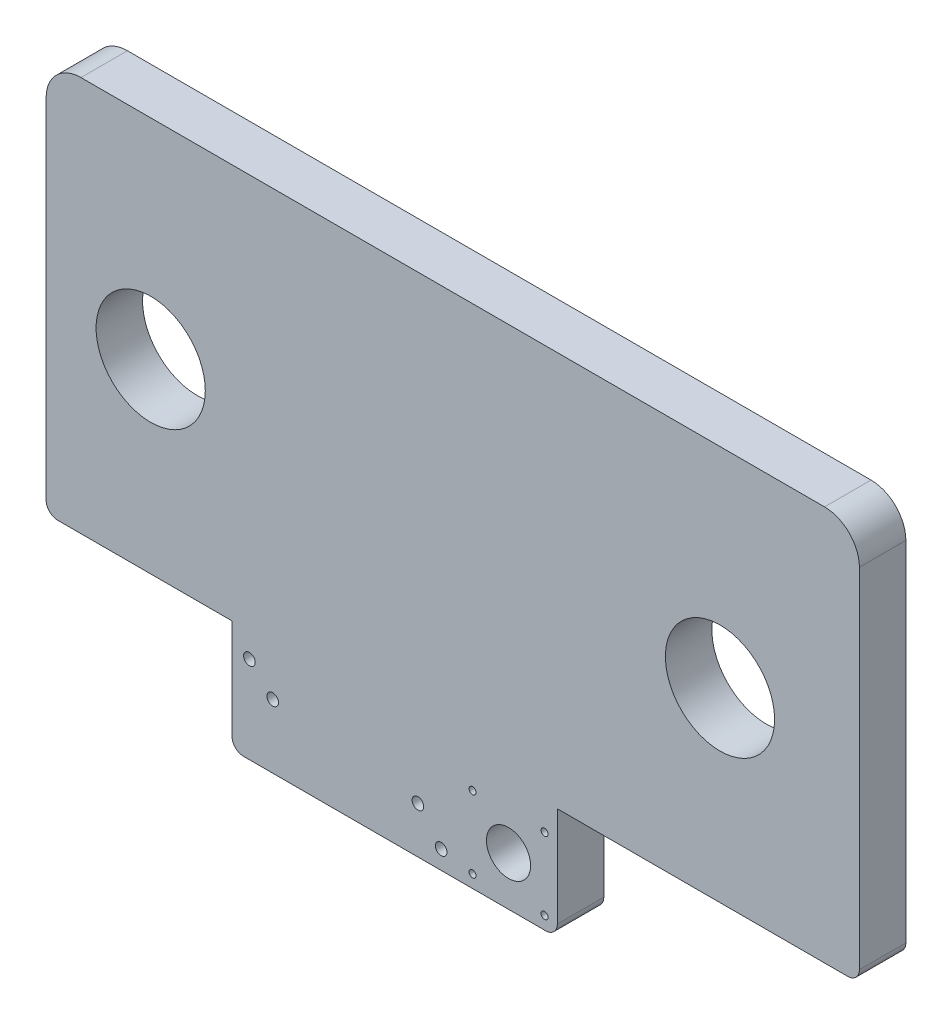
ISO-10303-21;
HEADER;
FILE_DESCRIPTION(('STEP AP214'),'2;1');
FILE_NAME('part.step','',(''),(''),'','','');
FILE_SCHEMA(('AUTOMOTIVE_DESIGN { 1 0 10303 214 1 1 1 1 }'));
ENDSEC;
DATA;
#1=APPLICATION_CONTEXT('core data for automotive mechanical design processes');
#2=APPLICATION_PROTOCOL_DEFINITION('international standard','automotive_design',2000,#1);
#3=PRODUCT_CONTEXT('',#1,'mechanical');
#4=PRODUCT('Part','Part','',(#3));
#5=PRODUCT_RELATED_PRODUCT_CATEGORY('part','',(#4));
#6=PRODUCT_DEFINITION_FORMATION('','',#4);
#7=PRODUCT_DEFINITION_CONTEXT('part definition',#1,'design');
#8=PRODUCT_DEFINITION('design','',#6,#7);
#9=PRODUCT_DEFINITION_SHAPE('','',#8);
#10=(LENGTH_UNIT() NAMED_UNIT(*) SI_UNIT(.MILLI.,.METRE.));
#11=(NAMED_UNIT(*) PLANE_ANGLE_UNIT() SI_UNIT($,.RADIAN.));
#12=(NAMED_UNIT(*) SI_UNIT($,.STERADIAN.) SOLID_ANGLE_UNIT());
#13=UNCERTAINTY_MEASURE_WITH_UNIT(LENGTH_MEASURE(1.E-05),#10,'distance_accuracy_value','');
#14=(GEOMETRIC_REPRESENTATION_CONTEXT(3) GLOBAL_UNCERTAINTY_ASSIGNED_CONTEXT((#13)) GLOBAL_UNIT_ASSIGNED_CONTEXT((#10,
#11,#12)) REPRESENTATION_CONTEXT('',''));
#15=CARTESIAN_POINT('',(0.,0.,0.));
#16=DIRECTION('',(0.,0.,1.));
#17=DIRECTION('',(1.,0.,0.));
#18=AXIS2_PLACEMENT_3D('',#15,#16,#17);
#19=CARTESIAN_POINT('',(222.853933060638,148.723609916555,20.));
#20=DIRECTION('',(0.,0.,1.));
#21=DIRECTION('',(1.,0.,0.));
#22=AXIS2_PLACEMENT_3D('',#19,#20,#21);
#23=CYLINDRICAL_SURFACE('',#22,15.);
#24=DIRECTION('',(0.,0.,1.));
#25=VECTOR('',#24,1.);
#26=CARTESIAN_POINT('',(237.853933060638,148.723609916555,20.));
#27=LINE('',#26,#25);
#28=CARTESIAN_POINT('',(237.853933060638,148.723609916555,0.));
#29=VERTEX_POINT('',#28);
#30=CARTESIAN_POINT('',(237.853933060638,148.723609916555,20.));
#31=VERTEX_POINT('',#30);
#32=EDGE_CURVE('E242',#29,#31,#27,.T.);
#33=ORIENTED_EDGE('',*,*,#32,.F.);
#34=CARTESIAN_POINT('',(222.853933060638,148.723609916555,0.));
#35=DIRECTION('',(0.,0.,-1.));
#36=DIRECTION('',(-1.,0.,0.));
#37=AXIS2_PLACEMENT_3D('',#34,#35,#36);
#38=CIRCLE('',#37,15.);
#39=CARTESIAN_POINT('',(222.853933060638,163.723609916555,0.));
#40=VERTEX_POINT('',#39);
#41=EDGE_CURVE('E42',#40,#29,#38,.T.);
#42=ORIENTED_EDGE('',*,*,#41,.F.);
#43=DIRECTION('',(0.,0.,1.));
#44=VECTOR('',#43,1.);
#45=CARTESIAN_POINT('',(222.853933060638,163.723609916555,20.));
#46=LINE('',#45,#44);
#47=CARTESIAN_POINT('',(222.853933060638,163.723609916555,20.));
#48=VERTEX_POINT('',#47);
#49=EDGE_CURVE('E245',#48,#40,#46,.F.);
#50=ORIENTED_EDGE('',*,*,#49,.F.);
#51=CARTESIAN_POINT('',(222.853933060638,148.723609916555,20.));
#52=DIRECTION('',(0.,0.,-1.));
#53=DIRECTION('',(-1.,0.,0.));
#54=AXIS2_PLACEMENT_3D('',#51,#52,#53);
#55=CIRCLE('',#54,15.);
#56=EDGE_CURVE('E11',#31,#48,#55,.F.);
#57=ORIENTED_EDGE('',*,*,#56,.F.);
#58=EDGE_LOOP('',(#33,#42,#50,#57));
#59=FACE_BOUND('',#58,.T.);
#60=ADVANCED_FACE('F35',(#59),#23,.T.);
#61=CARTESIAN_POINT('',(-97.1460669393624,148.723609916555,20.));
#62=DIRECTION('',(0.,0.,-1.));
#63=DIRECTION('',(-1.,0.,0.));
#64=AXIS2_PLACEMENT_3D('',#61,#62,#63);
#65=CYLINDRICAL_SURFACE('',#64,15.);
#66=DIRECTION('',(0.,0.,-1.));
#67=VECTOR('',#66,1.);
#68=CARTESIAN_POINT('',(-112.146066939362,148.723609916555,20.));
#69=LINE('',#68,#67);
#70=CARTESIAN_POINT('',(-112.146066939362,148.723609916555,20.));
#71=VERTEX_POINT('',#70);
#72=CARTESIAN_POINT('',(-112.146066939362,148.723609916555,0.));
#73=VERTEX_POINT('',#72);
#74=EDGE_CURVE('E231',#71,#73,#69,.T.);
#75=ORIENTED_EDGE('',*,*,#74,.F.);
#76=CARTESIAN_POINT('',(-97.1460669393624,148.723609916555,20.));
#77=DIRECTION('',(0.,0.,-1.));
#78=DIRECTION('',(-1.,0.,0.));
#79=AXIS2_PLACEMENT_3D('',#76,#77,#78);
#80=CIRCLE('',#79,15.);
#81=CARTESIAN_POINT('',(-97.1460669393624,163.723609916555,20.));
#82=VERTEX_POINT('',#81);
#83=EDGE_CURVE('E237',#82,#71,#80,.F.);
#84=ORIENTED_EDGE('',*,*,#83,.F.);
#85=DIRECTION('',(0.,0.,-1.));
#86=VECTOR('',#85,1.);
#87=CARTESIAN_POINT('',(-97.1460669393624,163.723609916555,20.));
#88=LINE('',#87,#86);
#89=CARTESIAN_POINT('',(-97.1460669393624,163.723609916555,0.));
#90=VERTEX_POINT('',#89);
#91=EDGE_CURVE('E234',#90,#82,#88,.F.);
#92=ORIENTED_EDGE('',*,*,#91,.F.);
#93=CARTESIAN_POINT('',(-97.1460669393624,148.723609916555,0.));
#94=DIRECTION('',(0.,0.,-1.));
#95=DIRECTION('',(-1.,0.,0.));
#96=AXIS2_PLACEMENT_3D('',#93,#94,#95);
#97=CIRCLE('',#96,15.);
#98=EDGE_CURVE('E239',#73,#90,#97,.T.);
#99=ORIENTED_EDGE('',*,*,#98,.F.);
#100=EDGE_LOOP('',(#75,#84,#92,#99));
#101=FACE_BOUND('',#100,.T.);
#102=ADVANCED_FACE('F288',(#101),#65,.T.);
#103=CARTESIAN_POINT('',(-107.146066939362,-1.2763900834446,20.));
#104=DIRECTION('',(0.,0.,-1.));
#105=DIRECTION('',(-1.,0.,0.));
#106=AXIS2_PLACEMENT_3D('',#103,#104,#105);
#107=CYLINDRICAL_SURFACE('',#106,5.);
#108=DIRECTION('',(0.,0.,-1.));
#109=VECTOR('',#108,1.);
#110=CARTESIAN_POINT('',(-107.146066939362,-6.2763900834446,20.));
#111=LINE('',#110,#109);
#112=CARTESIAN_POINT('',(-107.146066939362,-6.2763900834446,20.));
#113=VERTEX_POINT('',#112);
#114=CARTESIAN_POINT('',(-107.146066939362,-6.2763900834446,0.));
#115=VERTEX_POINT('',#114);
#116=EDGE_CURVE('E222',#113,#115,#111,.T.);
#117=ORIENTED_EDGE('',*,*,#116,.F.);
#118=CARTESIAN_POINT('',(-107.146066939362,-1.2763900834446,20.));
#119=DIRECTION('',(0.,0.,-1.));
#120=DIRECTION('',(-1.,0.,0.));
#121=AXIS2_PLACEMENT_3D('',#118,#119,#120);
#122=CIRCLE('',#121,5.);
#123=CARTESIAN_POINT('',(-112.146066939362,-1.2763900834446,20.));
#124=VERTEX_POINT('',#123);
#125=EDGE_CURVE('E138',#124,#113,#122,.F.);
#126=ORIENTED_EDGE('',*,*,#125,.F.);
#127=DIRECTION('',(0.,0.,-1.));
#128=VECTOR('',#127,1.);
#129=CARTESIAN_POINT('',(-112.146066939362,-1.2763900834446,20.));
#130=LINE('',#129,#128);
#131=CARTESIAN_POINT('',(-112.146066939362,-1.2763900834446,0.));
#132=VERTEX_POINT('',#131);
#133=EDGE_CURVE('E224',#132,#124,#130,.F.);
#134=ORIENTED_EDGE('',*,*,#133,.F.);
#135=CARTESIAN_POINT('',(-107.146066939362,-1.2763900834446,0.));
#136=DIRECTION('',(0.,0.,-1.));
#137=DIRECTION('',(-1.,0.,0.));
#138=AXIS2_PLACEMENT_3D('',#135,#136,#137);
#139=CIRCLE('',#138,5.);
#140=EDGE_CURVE('E228',#115,#132,#139,.T.);
#141=ORIENTED_EDGE('',*,*,#140,.F.);
#142=EDGE_LOOP('',(#117,#126,#134,#141));
#143=FACE_BOUND('',#142,.T.);
#144=ADVANCED_FACE('F281',(#143),#107,.T.);
#145=CARTESIAN_POINT('',(232.853933060638,-1.27639008344463,20.));
#146=DIRECTION('',(0.,0.,1.));
#147=DIRECTION('',(1.,0.,0.));
#148=AXIS2_PLACEMENT_3D('',#145,#146,#147);
#149=CYLINDRICAL_SURFACE('',#148,5.);
#150=DIRECTION('',(0.,0.,1.));
#151=VECTOR('',#150,1.);
#152=CARTESIAN_POINT('',(232.853933060638,-6.27639008344463,20.));
#153=LINE('',#152,#151);
#154=CARTESIAN_POINT('',(232.853933060638,-6.27639008344463,0.));
#155=VERTEX_POINT('',#154);
#156=CARTESIAN_POINT('',(232.853933060638,-6.27639008344463,20.));
#157=VERTEX_POINT('',#156);
#158=EDGE_CURVE('E212',#155,#157,#153,.T.);
#159=ORIENTED_EDGE('',*,*,#158,.F.);
#160=CARTESIAN_POINT('',(232.853933060638,-1.27639008344463,0.));
#161=DIRECTION('',(0.,0.,-1.));
#162=DIRECTION('',(-1.,0.,0.));
#163=AXIS2_PLACEMENT_3D('',#160,#161,#162);
#164=CIRCLE('',#163,5.);
#165=CARTESIAN_POINT('',(237.853933060638,-1.27639008344463,0.));
#166=VERTEX_POINT('',#165);
#167=EDGE_CURVE('E218',#166,#155,#164,.T.);
#168=ORIENTED_EDGE('',*,*,#167,.F.);
#169=DIRECTION('',(0.,0.,1.));
#170=VECTOR('',#169,1.);
#171=CARTESIAN_POINT('',(237.853933060638,-1.27639008344463,20.));
#172=LINE('',#171,#170);
#173=CARTESIAN_POINT('',(237.853933060638,-1.27639008344463,20.));
#174=VERTEX_POINT('',#173);
#175=EDGE_CURVE('E215',#174,#166,#172,.F.);
#176=ORIENTED_EDGE('',*,*,#175,.F.);
#177=CARTESIAN_POINT('',(232.853933060638,-1.27639008344463,20.));
#178=DIRECTION('',(0.,0.,-1.));
#179=DIRECTION('',(-1.,0.,0.));
#180=AXIS2_PLACEMENT_3D('',#177,#178,#179);
#181=CIRCLE('',#180,5.);
#182=EDGE_CURVE('E220',#157,#174,#181,.F.);
#183=ORIENTED_EDGE('',*,*,#182,.F.);
#184=EDGE_LOOP('',(#159,#168,#176,#183));
#185=FACE_BOUND('',#184,.T.);
#186=ADVANCED_FACE('F257',(#185),#149,.T.);
#187=CARTESIAN_POINT('',(102.853933060638,-49.2763900834446,20.));
#188=DIRECTION('',(0.,0.,1.));
#189=DIRECTION('',(1.,0.,0.));
#190=AXIS2_PLACEMENT_3D('',#187,#188,#189);
#191=CYLINDRICAL_SURFACE('',#190,5.);
#192=DIRECTION('',(0.,0.,1.));
#193=VECTOR('',#192,1.);
#194=CARTESIAN_POINT('',(102.853933060638,-54.2763900834446,20.));
#195=LINE('',#194,#193);
#196=CARTESIAN_POINT('',(102.853933060638,-54.2763900834446,0.));
#197=VERTEX_POINT('',#196);
#198=CARTESIAN_POINT('',(102.853933060638,-54.2763900834446,20.));
#199=VERTEX_POINT('',#198);
#200=EDGE_CURVE('E202',#197,#199,#195,.T.);
#201=ORIENTED_EDGE('',*,*,#200,.F.);
#202=CARTESIAN_POINT('',(102.853933060638,-49.2763900834446,0.));
#203=DIRECTION('',(0.,0.,-1.));
#204=DIRECTION('',(-1.,0.,0.));
#205=AXIS2_PLACEMENT_3D('',#202,#203,#204);
#206=CIRCLE('',#205,5.);
#207=CARTESIAN_POINT('',(107.853933060638,-49.2763900834446,0.));
#208=VERTEX_POINT('',#207);
#209=EDGE_CURVE('E208',#208,#197,#206,.T.);
#210=ORIENTED_EDGE('',*,*,#209,.F.);
#211=DIRECTION('',(0.,0.,1.));
#212=VECTOR('',#211,1.);
#213=CARTESIAN_POINT('',(107.853933060638,-49.2763900834446,20.));
#214=LINE('',#213,#212);
#215=CARTESIAN_POINT('',(107.853933060638,-49.2763900834446,20.));
#216=VERTEX_POINT('',#215);
#217=EDGE_CURVE('E205',#216,#208,#214,.F.);
#218=ORIENTED_EDGE('',*,*,#217,.F.);
#219=CARTESIAN_POINT('',(102.853933060638,-49.2763900834446,20.));
#220=DIRECTION('',(0.,0.,-1.));
#221=DIRECTION('',(-1.,0.,0.));
#222=AXIS2_PLACEMENT_3D('',#219,#220,#221);
#223=CIRCLE('',#222,5.);
#224=EDGE_CURVE('E210',#199,#216,#223,.F.);
#225=ORIENTED_EDGE('',*,*,#224,.F.);
#226=EDGE_LOOP('',(#201,#210,#218,#225));
#227=FACE_BOUND('',#226,.T.);
#228=ADVANCED_FACE('F270',(#227),#191,.T.);
#229=CARTESIAN_POINT('',(-27.1460669393624,-49.2763900834447,20.));
#230=DIRECTION('',(0.,0.,1.));
#231=DIRECTION('',(1.,0.,0.));
#232=AXIS2_PLACEMENT_3D('',#229,#230,#231);
#233=CYLINDRICAL_SURFACE('',#232,5.);
#234=DIRECTION('',(0.,0.,1.));
#235=VECTOR('',#234,1.);
#236=CARTESIAN_POINT('',(-32.1460669393624,-49.2763900834447,20.));
#237=LINE('',#236,#235);
#238=CARTESIAN_POINT('',(-32.1460669393624,-49.2763900834447,0.));
#239=VERTEX_POINT('',#238);
#240=CARTESIAN_POINT('',(-32.1460669393624,-49.2763900834447,20.));
#241=VERTEX_POINT('',#240);
#242=EDGE_CURVE('E152',#239,#241,#237,.T.);
#243=ORIENTED_EDGE('',*,*,#242,.F.);
#244=CARTESIAN_POINT('',(-27.1460669393624,-49.2763900834447,0.));
#245=DIRECTION('',(0.,0.,-1.));
#246=DIRECTION('',(-1.,0.,0.));
#247=AXIS2_PLACEMENT_3D('',#244,#245,#246);
#248=CIRCLE('',#247,5.);
#249=CARTESIAN_POINT('',(-27.1460669393625,-54.2763900834447,0.));
#250=VERTEX_POINT('',#249);
#251=EDGE_CURVE('E198',#250,#239,#248,.T.);
#252=ORIENTED_EDGE('',*,*,#251,.F.);
#253=DIRECTION('',(0.,0.,1.));
#254=VECTOR('',#253,1.);
#255=CARTESIAN_POINT('',(-27.1460669393624,-54.2763900834447,20.));
#256=LINE('',#255,#254);
#257=CARTESIAN_POINT('',(-27.1460669393625,-54.2763900834447,20.));
#258=VERTEX_POINT('',#257);
#259=EDGE_CURVE('E195',#258,#250,#256,.F.);
#260=ORIENTED_EDGE('',*,*,#259,.F.);
#261=CARTESIAN_POINT('',(-27.1460669393624,-49.2763900834447,20.));
#262=DIRECTION('',(0.,0.,-1.));
#263=DIRECTION('',(-1.,0.,0.));
#264=AXIS2_PLACEMENT_3D('',#261,#262,#263);
#265=CIRCLE('',#264,5.);
#266=EDGE_CURVE('E200',#241,#258,#265,.F.);
#267=ORIENTED_EDGE('',*,*,#266,.F.);
#268=EDGE_LOOP('',(#243,#252,#260,#267));
#269=FACE_BOUND('',#268,.T.);
#270=ADVANCED_FACE('F277',(#269),#233,.T.);
#271=CARTESIAN_POINT('',(0.,0.,20.));
#272=DIRECTION('',(0.,0.,-1.));
#273=DIRECTION('',(-1.,0.,0.));
#274=AXIS2_PLACEMENT_3D('',#271,#272,#273);
#275=PLANE('',#274);
#276=CARTESIAN_POINT('',(102.353933060638,-17.7763900834447,20.));
#277=DIRECTION('',(0.,0.,1.));
#278=DIRECTION('',(-1.,0.,0.));
#279=AXIS2_PLACEMENT_3D('',#276,#277,#278);
#280=CIRCLE('',#279,1.5);
#281=CARTESIAN_POINT('',(100.853933060638,-17.7763900834447,20.));
#282=VERTEX_POINT('',#281);
#283=EDGE_CURVE('E336',#282,#282,#280,.T.);
#284=ORIENTED_EDGE('',*,*,#283,.F.);
#285=EDGE_LOOP('',(#284));
#286=FACE_BOUND('',#285,.T.);
#287=CARTESIAN_POINT('',(102.353933060638,-48.7763900834447,20.));
#288=DIRECTION('',(0.,0.,1.));
#289=DIRECTION('',(1.,0.,0.));
#290=AXIS2_PLACEMENT_3D('',#287,#288,#289);
#291=CIRCLE('',#290,1.5);
#292=CARTESIAN_POINT('',(103.853933060638,-48.7763900834447,20.));
#293=VERTEX_POINT('',#292);
#294=EDGE_CURVE('E342',#293,#293,#291,.T.);
#295=ORIENTED_EDGE('',*,*,#294,.F.);
#296=EDGE_LOOP('',(#295));
#297=FACE_BOUND('',#296,.T.);
#298=CARTESIAN_POINT('',(71.3539330606376,-48.7763900834447,20.));
#299=DIRECTION('',(0.,0.,1.));
#300=DIRECTION('',(-1.,0.,0.));
#301=AXIS2_PLACEMENT_3D('',#298,#299,#300);
#302=CIRCLE('',#301,1.5);
#303=CARTESIAN_POINT('',(69.8539330606376,-48.7763900834447,20.));
#304=VERTEX_POINT('',#303);
#305=EDGE_CURVE('E348',#304,#304,#302,.T.);
#306=ORIENTED_EDGE('',*,*,#305,.F.);
#307=EDGE_LOOP('',(#306));
#308=FACE_BOUND('',#307,.T.);
#309=CARTESIAN_POINT('',(71.3539330606376,-17.7763900834447,20.));
#310=DIRECTION('',(0.,0.,1.));
#311=DIRECTION('',(1.,0.,0.));
#312=AXIS2_PLACEMENT_3D('',#309,#310,#311);
#313=CIRCLE('',#312,1.5);
#314=CARTESIAN_POINT('',(72.8539330606376,-17.7763900834447,20.));
#315=VERTEX_POINT('',#314);
#316=EDGE_CURVE('E354',#315,#315,#313,.T.);
#317=ORIENTED_EDGE('',*,*,#316,.F.);
#318=EDGE_LOOP('',(#317));
#319=FACE_BOUND('',#318,.T.);
#320=CARTESIAN_POINT('',(86.8539330606376,-33.2763900834447,20.));
#321=DIRECTION('',(0.,0.,1.));
#322=DIRECTION('',(1.,0.,0.));
#323=AXIS2_PLACEMENT_3D('',#320,#321,#322);
#324=CIRCLE('',#323,9.49999999999999);
#325=CARTESIAN_POINT('',(96.3539330606376,-33.2763900834447,20.));
#326=VERTEX_POINT('',#325);
#327=EDGE_CURVE('E330',#326,#326,#324,.T.);
#328=ORIENTED_EDGE('',*,*,#327,.F.);
#329=EDGE_LOOP('',(#328));
#330=FACE_BOUND('',#329,.T.);
#331=CARTESIAN_POINT('',(-24.6460669393624,-16.7763900834446,20.));
#332=DIRECTION('',(0.,0.,1.));
#333=DIRECTION('',(1.,0.,0.));
#334=AXIS2_PLACEMENT_3D('',#331,#332,#333);
#335=CIRCLE('',#334,2.5);
#336=CARTESIAN_POINT('',(-22.1460669393624,-16.7763900834446,20.));
#337=VERTEX_POINT('',#336);
#338=EDGE_CURVE('E325',#337,#337,#335,.T.);
#339=ORIENTED_EDGE('',*,*,#338,.F.);
#340=EDGE_LOOP('',(#339));
#341=FACE_BOUND('',#340,.T.);
#342=CARTESIAN_POINT('',(-14.6460669393625,-26.7763900834446,20.));
#343=DIRECTION('',(0.,0.,1.));
#344=DIRECTION('',(1.,0.,0.));
#345=AXIS2_PLACEMENT_3D('',#342,#343,#344);
#346=CIRCLE('',#345,2.5);
#347=CARTESIAN_POINT('',(-12.1460669393624,-26.7763900834446,20.));
#348=VERTEX_POINT('',#347);
#349=EDGE_CURVE('E318',#348,#348,#346,.T.);
#350=ORIENTED_EDGE('',*,*,#349,.F.);
#351=EDGE_LOOP('',(#350));
#352=FACE_BOUND('',#351,.T.);
#353=CARTESIAN_POINT('',(47.8539330606376,-34.2763900834446,20.));
#354=DIRECTION('',(0.,0.,1.));
#355=DIRECTION('',(1.,0.,0.));
#356=AXIS2_PLACEMENT_3D('',#353,#354,#355);
#357=CIRCLE('',#356,2.5);
#358=CARTESIAN_POINT('',(50.3539330606376,-34.2763900834446,20.));
#359=VERTEX_POINT('',#358);
#360=EDGE_CURVE('E313',#359,#359,#357,.T.);
#361=ORIENTED_EDGE('',*,*,#360,.F.);
#362=EDGE_LOOP('',(#361));
#363=FACE_BOUND('',#362,.T.);
#364=CARTESIAN_POINT('',(57.8539330606376,-46.2763900834447,20.));
#365=DIRECTION('',(0.,0.,1.));
#366=DIRECTION('',(1.,0.,0.));
#367=AXIS2_PLACEMENT_3D('',#364,#365,#366);
#368=CIRCLE('',#367,2.5);
#369=CARTESIAN_POINT('',(60.3539330606376,-46.2763900834447,20.));
#370=VERTEX_POINT('',#369);
#371=EDGE_CURVE('E306',#370,#370,#368,.T.);
#372=ORIENTED_EDGE('',*,*,#371,.F.);
#373=EDGE_LOOP('',(#372));
#374=FACE_BOUND('',#373,.T.);
#375=DIRECTION('',(0.,1.,0.));
#376=VECTOR('',#375,1.);
#377=CARTESIAN_POINT('',(237.853933060638,163.723609916555,20.));
#378=LINE('',#377,#376);
#379=EDGE_CURVE('E169',#174,#31,#378,.T.);
#380=ORIENTED_EDGE('',*,*,#379,.T.);
#381=ORIENTED_EDGE('',*,*,#56,.T.);
#382=DIRECTION('',(-1.,0.,0.));
#383=VECTOR('',#382,1.);
#384=CARTESIAN_POINT('',(-112.146066939362,163.723609916555,20.));
#385=LINE('',#384,#383);
#386=EDGE_CURVE('E171',#48,#82,#385,.T.);
#387=ORIENTED_EDGE('',*,*,#386,.T.);
#388=ORIENTED_EDGE('',*,*,#83,.T.);
#389=DIRECTION('',(0.,-1.,0.));
#390=VECTOR('',#389,1.);
#391=CARTESIAN_POINT('',(-112.146066939362,-6.27639008344461,20.));
#392=LINE('',#391,#390);
#393=EDGE_CURVE('E142',#71,#124,#392,.T.);
#394=ORIENTED_EDGE('',*,*,#393,.T.);
#395=ORIENTED_EDGE('',*,*,#125,.T.);
#396=DIRECTION('',(1.,0.,0.));
#397=VECTOR('',#396,1.);
#398=CARTESIAN_POINT('',(-32.1460669393624,-6.2763900834446,20.));
#399=LINE('',#398,#397);
#400=CARTESIAN_POINT('',(-32.1460669393624,-6.2763900834446,20.));
#401=VERTEX_POINT('',#400);
#402=EDGE_CURVE('E131',#113,#401,#399,.T.);
#403=ORIENTED_EDGE('',*,*,#402,.T.);
#404=DIRECTION('',(0.,-1.,0.));
#405=VECTOR('',#404,1.);
#406=CARTESIAN_POINT('',(-32.1460669393624,-54.2763900834447,20.));
#407=LINE('',#406,#405);
#408=EDGE_CURVE('E136',#401,#241,#407,.T.);
#409=ORIENTED_EDGE('',*,*,#408,.T.);
#410=ORIENTED_EDGE('',*,*,#266,.T.);
#411=DIRECTION('',(1.,0.,0.));
#412=VECTOR('',#411,1.);
#413=CARTESIAN_POINT('',(107.853933060638,-54.2763900834446,20.));
#414=LINE('',#413,#412);
#415=EDGE_CURVE('E158',#258,#199,#414,.T.);
#416=ORIENTED_EDGE('',*,*,#415,.T.);
#417=ORIENTED_EDGE('',*,*,#224,.T.);
#418=DIRECTION('',(0.,1.,0.));
#419=VECTOR('',#418,1.);
#420=CARTESIAN_POINT('',(107.853933060638,-6.27639008344465,20.));
#421=LINE('',#420,#419);
#422=CARTESIAN_POINT('',(107.853933060638,-6.27639008344465,20.));
#423=VERTEX_POINT('',#422);
#424=EDGE_CURVE('E161',#216,#423,#421,.T.);
#425=ORIENTED_EDGE('',*,*,#424,.T.);
#426=DIRECTION('',(1.,0.,0.));
#427=VECTOR('',#426,1.);
#428=CARTESIAN_POINT('',(237.853933060638,-6.27639008344463,20.));
#429=LINE('',#428,#427);
#430=EDGE_CURVE('E166',#423,#157,#429,.T.);
#431=ORIENTED_EDGE('',*,*,#430,.T.);
#432=ORIENTED_EDGE('',*,*,#182,.T.);
#433=EDGE_LOOP('',(#380,#381,#387,#388,#394,#395,#403,#409,#410,#416,#417,#425,#431,#432));
#434=FACE_BOUND('',#433,.T.);
#435=CARTESIAN_POINT('',(177.853933060638,73.7236099165554,20.));
#436=DIRECTION('',(0.,0.,1.));
#437=DIRECTION('',(1.,0.,0.));
#438=AXIS2_PLACEMENT_3D('',#435,#436,#437);
#439=CIRCLE('',#438,23.5);
#440=CARTESIAN_POINT('',(201.353933060638,73.7236099165554,20.));
#441=VERTEX_POINT('',#440);
#442=EDGE_CURVE('E175',#441,#441,#439,.T.);
#443=ORIENTED_EDGE('',*,*,#442,.F.);
#444=EDGE_LOOP('',(#443));
#445=FACE_BOUND('',#444,.T.);
#446=CARTESIAN_POINT('',(-67.1460669393624,73.7236099165554,20.));
#447=DIRECTION('',(0.,0.,1.));
#448=DIRECTION('',(1.,0.,0.));
#449=AXIS2_PLACEMENT_3D('',#446,#447,#448);
#450=CIRCLE('',#449,23.5);
#451=CARTESIAN_POINT('',(-43.6460669393624,73.7236099165554,20.));
#452=VERTEX_POINT('',#451);
#453=EDGE_CURVE('E297',#452,#452,#450,.T.);
#454=ORIENTED_EDGE('',*,*,#453,.F.);
#455=EDGE_LOOP('',(#454));
#456=FACE_BOUND('',#455,.T.);
#457=ADVANCED_FACE('F133',(#286,#297,#308,#319,#330,#341,#352,#363,#374,#434,#445,#456),#275,.F.);
#458=CARTESIAN_POINT('',(0.,0.,0.));
#459=DIRECTION('',(0.,0.,-1.));
#460=DIRECTION('',(-1.,0.,0.));
#461=AXIS2_PLACEMENT_3D('',#458,#459,#460);
#462=PLANE('',#461);
#463=CARTESIAN_POINT('',(102.353933060638,-17.7763900834447,0.));
#464=DIRECTION('',(0.,0.,1.));
#465=DIRECTION('',(-1.,0.,0.));
#466=AXIS2_PLACEMENT_3D('',#463,#464,#465);
#467=CIRCLE('',#466,1.5);
#468=CARTESIAN_POINT('',(100.853933060638,-17.7763900834447,0.));
#469=VERTEX_POINT('',#468);
#470=EDGE_CURVE('E339',#469,#469,#467,.T.);
#471=ORIENTED_EDGE('',*,*,#470,.T.);
#472=EDGE_LOOP('',(#471));
#473=FACE_BOUND('',#472,.T.);
#474=CARTESIAN_POINT('',(102.353933060638,-48.7763900834447,0.));
#475=DIRECTION('',(0.,0.,1.));
#476=DIRECTION('',(1.,0.,0.));
#477=AXIS2_PLACEMENT_3D('',#474,#475,#476);
#478=CIRCLE('',#477,1.5);
#479=CARTESIAN_POINT('',(103.853933060638,-48.7763900834447,0.));
#480=VERTEX_POINT('',#479);
#481=EDGE_CURVE('E345',#480,#480,#478,.T.);
#482=ORIENTED_EDGE('',*,*,#481,.T.);
#483=EDGE_LOOP('',(#482));
#484=FACE_BOUND('',#483,.T.);
#485=CARTESIAN_POINT('',(71.3539330606376,-48.7763900834447,0.));
#486=DIRECTION('',(0.,0.,1.));
#487=DIRECTION('',(-1.,0.,0.));
#488=AXIS2_PLACEMENT_3D('',#485,#486,#487);
#489=CIRCLE('',#488,1.5);
#490=CARTESIAN_POINT('',(69.8539330606376,-48.7763900834447,0.));
#491=VERTEX_POINT('',#490);
#492=EDGE_CURVE('E351',#491,#491,#489,.T.);
#493=ORIENTED_EDGE('',*,*,#492,.T.);
#494=EDGE_LOOP('',(#493));
#495=FACE_BOUND('',#494,.T.);
#496=CARTESIAN_POINT('',(71.3539330606376,-17.7763900834447,0.));
#497=DIRECTION('',(0.,0.,1.));
#498=DIRECTION('',(1.,0.,0.));
#499=AXIS2_PLACEMENT_3D('',#496,#497,#498);
#500=CIRCLE('',#499,1.5);
#501=CARTESIAN_POINT('',(72.8539330606376,-17.7763900834447,0.));
#502=VERTEX_POINT('',#501);
#503=EDGE_CURVE('E333',#502,#502,#500,.T.);
#504=ORIENTED_EDGE('',*,*,#503,.T.);
#505=EDGE_LOOP('',(#504));
#506=FACE_BOUND('',#505,.T.);
#507=CARTESIAN_POINT('',(86.8539330606376,-33.2763900834447,0.));
#508=DIRECTION('',(0.,0.,1.));
#509=DIRECTION('',(1.,0.,0.));
#510=AXIS2_PLACEMENT_3D('',#507,#508,#509);
#511=CIRCLE('',#510,9.49999999999999);
#512=CARTESIAN_POINT('',(96.3539330606376,-33.2763900834447,0.));
#513=VERTEX_POINT('',#512);
#514=EDGE_CURVE('E322',#513,#513,#511,.T.);
#515=ORIENTED_EDGE('',*,*,#514,.T.);
#516=EDGE_LOOP('',(#515));
#517=FACE_BOUND('',#516,.T.);
#518=CARTESIAN_POINT('',(-24.6460669393624,-16.7763900834446,0.));
#519=DIRECTION('',(0.,0.,1.));
#520=DIRECTION('',(1.,0.,0.));
#521=AXIS2_PLACEMENT_3D('',#518,#519,#520);
#522=CIRCLE('',#521,2.5);
#523=CARTESIAN_POINT('',(-22.1460669393624,-16.7763900834446,0.));
#524=VERTEX_POINT('',#523);
#525=EDGE_CURVE('E310',#524,#524,#522,.T.);
#526=ORIENTED_EDGE('',*,*,#525,.T.);
#527=EDGE_LOOP('',(#526));
#528=FACE_BOUND('',#527,.T.);
#529=CARTESIAN_POINT('',(-14.6460669393625,-26.7763900834446,0.));
#530=DIRECTION('',(0.,0.,1.));
#531=DIRECTION('',(1.,0.,0.));
#532=AXIS2_PLACEMENT_3D('',#529,#530,#531);
#533=CIRCLE('',#532,2.5);
#534=CARTESIAN_POINT('',(-12.1460669393624,-26.7763900834446,0.));
#535=VERTEX_POINT('',#534);
#536=EDGE_CURVE('E321',#535,#535,#533,.T.);
#537=ORIENTED_EDGE('',*,*,#536,.T.);
#538=EDGE_LOOP('',(#537));
#539=FACE_BOUND('',#538,.T.);
#540=CARTESIAN_POINT('',(47.8539330606376,-34.2763900834446,0.));
#541=DIRECTION('',(0.,0.,1.));
#542=DIRECTION('',(1.,0.,0.));
#543=AXIS2_PLACEMENT_3D('',#540,#541,#542);
#544=CIRCLE('',#543,2.5);
#545=CARTESIAN_POINT('',(50.3539330606376,-34.2763900834446,0.));
#546=VERTEX_POINT('',#545);
#547=EDGE_CURVE('E303',#546,#546,#544,.T.);
#548=ORIENTED_EDGE('',*,*,#547,.T.);
#549=EDGE_LOOP('',(#548));
#550=FACE_BOUND('',#549,.T.);
#551=CARTESIAN_POINT('',(57.8539330606376,-46.2763900834447,0.));
#552=DIRECTION('',(0.,0.,1.));
#553=DIRECTION('',(1.,0.,0.));
#554=AXIS2_PLACEMENT_3D('',#551,#552,#553);
#555=CIRCLE('',#554,2.5);
#556=CARTESIAN_POINT('',(60.3539330606376,-46.2763900834447,0.));
#557=VERTEX_POINT('',#556);
#558=EDGE_CURVE('E309',#557,#557,#555,.T.);
#559=ORIENTED_EDGE('',*,*,#558,.T.);
#560=EDGE_LOOP('',(#559));
#561=FACE_BOUND('',#560,.T.);
#562=CARTESIAN_POINT('',(177.853933060638,73.7236099165554,0.));
#563=DIRECTION('',(0.,0.,1.));
#564=DIRECTION('',(1.,0.,0.));
#565=AXIS2_PLACEMENT_3D('',#562,#563,#564);
#566=CIRCLE('',#565,23.5);
#567=CARTESIAN_POINT('',(201.353933060638,73.7236099165554,0.));
#568=VERTEX_POINT('',#567);
#569=EDGE_CURVE('E294',#568,#568,#566,.T.);
#570=ORIENTED_EDGE('',*,*,#569,.T.);
#571=EDGE_LOOP('',(#570));
#572=FACE_BOUND('',#571,.T.);
#573=DIRECTION('',(-1.,0.,0.));
#574=VECTOR('',#573,1.);
#575=CARTESIAN_POINT('',(-112.146066939362,163.723609916555,0.));
#576=LINE('',#575,#574);
#577=EDGE_CURVE('E190',#40,#90,#576,.T.);
#578=ORIENTED_EDGE('',*,*,#577,.F.);
#579=ORIENTED_EDGE('',*,*,#41,.T.);
#580=DIRECTION('',(0.,1.,0.));
#581=VECTOR('',#580,1.);
#582=CARTESIAN_POINT('',(237.853933060638,163.723609916555,0.));
#583=LINE('',#582,#581);
#584=EDGE_CURVE('E187',#166,#29,#583,.T.);
#585=ORIENTED_EDGE('',*,*,#584,.F.);
#586=ORIENTED_EDGE('',*,*,#167,.T.);
#587=DIRECTION('',(1.,0.,0.));
#588=VECTOR('',#587,1.);
#589=CARTESIAN_POINT('',(237.853933060638,-6.27639008344463,0.));
#590=LINE('',#589,#588);
#591=CARTESIAN_POINT('',(107.853933060638,-6.27639008344465,0.));
#592=VERTEX_POINT('',#591);
#593=EDGE_CURVE('E184',#592,#155,#590,.T.);
#594=ORIENTED_EDGE('',*,*,#593,.F.);
#595=DIRECTION('',(0.,1.,0.));
#596=VECTOR('',#595,1.);
#597=CARTESIAN_POINT('',(107.853933060638,-6.27639008344465,0.));
#598=LINE('',#597,#596);
#599=EDGE_CURVE('E182',#208,#592,#598,.T.);
#600=ORIENTED_EDGE('',*,*,#599,.F.);
#601=ORIENTED_EDGE('',*,*,#209,.T.);
#602=DIRECTION('',(1.,0.,0.));
#603=VECTOR('',#602,1.);
#604=CARTESIAN_POINT('',(107.853933060638,-54.2763900834446,0.));
#605=LINE('',#604,#603);
#606=EDGE_CURVE('E179',#250,#197,#605,.T.);
#607=ORIENTED_EDGE('',*,*,#606,.F.);
#608=ORIENTED_EDGE('',*,*,#251,.T.);
#609=DIRECTION('',(0.,-1.,0.));
#610=VECTOR('',#609,1.);
#611=CARTESIAN_POINT('',(-32.1460669393624,-54.2763900834447,0.));
#612=LINE('',#611,#610);
#613=CARTESIAN_POINT('',(-32.1460669393624,-6.2763900834446,0.));
#614=VERTEX_POINT('',#613);
#615=EDGE_CURVE('E177',#614,#239,#612,.T.);
#616=ORIENTED_EDGE('',*,*,#615,.F.);
#617=DIRECTION('',(1.,0.,0.));
#618=VECTOR('',#617,1.);
#619=CARTESIAN_POINT('',(-32.1460669393624,-6.2763900834446,0.));
#620=LINE('',#619,#618);
#621=EDGE_CURVE('E148',#115,#614,#620,.T.);
#622=ORIENTED_EDGE('',*,*,#621,.F.);
#623=ORIENTED_EDGE('',*,*,#140,.T.);
#624=DIRECTION('',(0.,-1.,0.));
#625=VECTOR('',#624,1.);
#626=CARTESIAN_POINT('',(-112.146066939362,-6.27639008344461,0.));
#627=LINE('',#626,#625);
#628=EDGE_CURVE('E173',#73,#132,#627,.T.);
#629=ORIENTED_EDGE('',*,*,#628,.F.);
#630=ORIENTED_EDGE('',*,*,#98,.T.);
#631=EDGE_LOOP('',(#578,#579,#585,#586,#594,#600,#601,#607,#608,#616,#622,#623,#629,#630));
#632=FACE_BOUND('',#631,.T.);
#633=CARTESIAN_POINT('',(-67.1460669393624,73.7236099165554,0.));
#634=DIRECTION('',(0.,0.,1.));
#635=DIRECTION('',(1.,0.,0.));
#636=AXIS2_PLACEMENT_3D('',#633,#634,#635);
#637=CIRCLE('',#636,23.5);
#638=CARTESIAN_POINT('',(-43.6460669393624,73.7236099165554,0.));
#639=VERTEX_POINT('',#638);
#640=EDGE_CURVE('E300',#639,#639,#637,.T.);
#641=ORIENTED_EDGE('',*,*,#640,.T.);
#642=EDGE_LOOP('',(#641));
#643=FACE_BOUND('',#642,.T.);
#644=ADVANCED_FACE('F249',(#473,#484,#495,#506,#517,#528,#539,#550,#561,#572,#632,#643),#462,.T.);
#645=CARTESIAN_POINT('',(-112.146066939362,-6.27639008344461,20.));
#646=DIRECTION('',(1.,0.,0.));
#647=DIRECTION('',(0.,0.,-1.));
#648=AXIS2_PLACEMENT_3D('',#645,#646,#647);
#649=PLANE('',#648);
#650=ORIENTED_EDGE('',*,*,#393,.F.);
#651=ORIENTED_EDGE('',*,*,#74,.T.);
#652=ORIENTED_EDGE('',*,*,#628,.T.);
#653=ORIENTED_EDGE('',*,*,#133,.T.);
#654=EDGE_LOOP('',(#650,#651,#652,#653));
#655=FACE_BOUND('',#654,.T.);
#656=ADVANCED_FACE('F284',(#655),#649,.F.);
#657=CARTESIAN_POINT('',(-32.1460669393624,-6.2763900834446,20.));
#658=DIRECTION('',(0.,1.,0.));
#659=DIRECTION('',(-1.,0.,0.));
#660=AXIS2_PLACEMENT_3D('',#657,#658,#659);
#661=PLANE('',#660);
#662=ORIENTED_EDGE('',*,*,#402,.F.);
#663=ORIENTED_EDGE('',*,*,#116,.T.);
#664=ORIENTED_EDGE('',*,*,#621,.T.);
#665=DIRECTION('',(0.,0.,-1.));
#666=VECTOR('',#665,1.);
#667=CARTESIAN_POINT('',(-32.1460669393624,-6.2763900834446,20.));
#668=LINE('',#667,#666);
#669=EDGE_CURVE('E145',#401,#614,#668,.T.);
#670=ORIENTED_EDGE('',*,*,#669,.F.);
#671=EDGE_LOOP('',(#662,#663,#664,#670));
#672=FACE_BOUND('',#671,.T.);
#673=ADVANCED_FACE('F146',(#672),#661,.F.);
#674=CARTESIAN_POINT('',(-32.1460669393624,-54.2763900834447,20.));
#675=DIRECTION('',(1.,0.,0.));
#676=DIRECTION('',(0.,0.,-1.));
#677=AXIS2_PLACEMENT_3D('',#674,#675,#676);
#678=PLANE('',#677);
#679=ORIENTED_EDGE('',*,*,#615,.T.);
#680=ORIENTED_EDGE('',*,*,#242,.T.);
#681=ORIENTED_EDGE('',*,*,#408,.F.);
#682=ORIENTED_EDGE('',*,*,#669,.T.);
#683=EDGE_LOOP('',(#679,#680,#681,#682));
#684=FACE_BOUND('',#683,.T.);
#685=ADVANCED_FACE('F156',(#684),#678,.F.);
#686=CARTESIAN_POINT('',(107.853933060638,-54.2763900834446,20.));
#687=DIRECTION('',(0.,1.,0.));
#688=DIRECTION('',(-1.,0.,0.));
#689=AXIS2_PLACEMENT_3D('',#686,#687,#688);
#690=PLANE('',#689);
#691=ORIENTED_EDGE('',*,*,#606,.T.);
#692=ORIENTED_EDGE('',*,*,#200,.T.);
#693=ORIENTED_EDGE('',*,*,#415,.F.);
#694=ORIENTED_EDGE('',*,*,#259,.T.);
#695=EDGE_LOOP('',(#691,#692,#693,#694));
#696=FACE_BOUND('',#695,.T.);
#697=ADVANCED_FACE('F273',(#696),#690,.F.);
#698=CARTESIAN_POINT('',(107.853933060638,-6.27639008344465,20.));
#699=DIRECTION('',(-1.,0.,0.));
#700=DIRECTION('',(0.,0.,1.));
#701=AXIS2_PLACEMENT_3D('',#698,#699,#700);
#702=PLANE('',#701);
#703=ORIENTED_EDGE('',*,*,#424,.F.);
#704=ORIENTED_EDGE('',*,*,#217,.T.);
#705=ORIENTED_EDGE('',*,*,#599,.T.);
#706=DIRECTION('',(0.,0.,-1.));
#707=VECTOR('',#706,1.);
#708=CARTESIAN_POINT('',(107.853933060638,-6.27639008344465,20.));
#709=LINE('',#708,#707);
#710=EDGE_CURVE('E153',#423,#592,#709,.T.);
#711=ORIENTED_EDGE('',*,*,#710,.F.);
#712=EDGE_LOOP('',(#703,#704,#705,#711));
#713=FACE_BOUND('',#712,.T.);
#714=ADVANCED_FACE('F266',(#713),#702,.F.);
#715=CARTESIAN_POINT('',(237.853933060638,-6.27639008344463,20.));
#716=DIRECTION('',(0.,1.,0.));
#717=DIRECTION('',(-1.,0.,0.));
#718=AXIS2_PLACEMENT_3D('',#715,#716,#717);
#719=PLANE('',#718);
#720=ORIENTED_EDGE('',*,*,#593,.T.);
#721=ORIENTED_EDGE('',*,*,#158,.T.);
#722=ORIENTED_EDGE('',*,*,#430,.F.);
#723=ORIENTED_EDGE('',*,*,#710,.T.);
#724=EDGE_LOOP('',(#720,#721,#722,#723));
#725=FACE_BOUND('',#724,.T.);
#726=ADVANCED_FACE('F261',(#725),#719,.F.);
#727=CARTESIAN_POINT('',(237.853933060638,163.723609916555,20.));
#728=DIRECTION('',(-1.,0.,0.));
#729=DIRECTION('',(0.,-1.,0.));
#730=AXIS2_PLACEMENT_3D('',#727,#728,#729);
#731=PLANE('',#730);
#732=ORIENTED_EDGE('',*,*,#584,.T.);
#733=ORIENTED_EDGE('',*,*,#32,.T.);
#734=ORIENTED_EDGE('',*,*,#379,.F.);
#735=ORIENTED_EDGE('',*,*,#175,.T.);
#736=EDGE_LOOP('',(#732,#733,#734,#735));
#737=FACE_BOUND('',#736,.T.);
#738=ADVANCED_FACE('F253',(#737),#731,.F.);
#739=CARTESIAN_POINT('',(-112.146066939362,163.723609916555,20.));
#740=DIRECTION('',(0.,-1.,0.));
#741=DIRECTION('',(1.,0.,0.));
#742=AXIS2_PLACEMENT_3D('',#739,#740,#741);
#743=PLANE('',#742);
#744=ORIENTED_EDGE('',*,*,#386,.F.);
#745=ORIENTED_EDGE('',*,*,#49,.T.);
#746=ORIENTED_EDGE('',*,*,#577,.T.);
#747=ORIENTED_EDGE('',*,*,#91,.T.);
#748=EDGE_LOOP('',(#744,#745,#746,#747));
#749=FACE_BOUND('',#748,.T.);
#750=ADVANCED_FACE('F292',(#749),#743,.F.);
#751=CARTESIAN_POINT('',(177.853933060638,73.7236099165554,20.));
#752=DIRECTION('',(0.,0.,-1.));
#753=DIRECTION('',(-1.,0.,0.));
#754=AXIS2_PLACEMENT_3D('',#751,#752,#753);
#755=CYLINDRICAL_SURFACE('',#754,23.5);
#756=ORIENTED_EDGE('',*,*,#442,.T.);
#757=EDGE_LOOP('',(#756));
#758=FACE_BOUND('',#757,.T.);
#759=ORIENTED_EDGE('',*,*,#569,.F.);
#760=EDGE_LOOP('',(#759));
#761=FACE_BOUND('',#760,.T.);
#762=ADVANCED_FACE('F397',(#758,#761),#755,.F.);
#763=CARTESIAN_POINT('',(-67.1460669393624,73.7236099165554,20.));
#764=DIRECTION('',(0.,0.,-1.));
#765=DIRECTION('',(-1.,0.,0.));
#766=AXIS2_PLACEMENT_3D('',#763,#764,#765);
#767=CYLINDRICAL_SURFACE('',#766,23.5);
#768=ORIENTED_EDGE('',*,*,#453,.T.);
#769=EDGE_LOOP('',(#768));
#770=FACE_BOUND('',#769,.T.);
#771=ORIENTED_EDGE('',*,*,#640,.F.);
#772=EDGE_LOOP('',(#771));
#773=FACE_BOUND('',#772,.T.);
#774=ADVANCED_FACE('F387',(#770,#773),#767,.F.);
#775=CARTESIAN_POINT('',(57.8539330606376,-46.2763900834447,0.));
#776=DIRECTION('',(0.,0.,1.));
#777=DIRECTION('',(1.,0.,0.));
#778=AXIS2_PLACEMENT_3D('',#775,#776,#777);
#779=CYLINDRICAL_SURFACE('',#778,2.5);
#780=ORIENTED_EDGE('',*,*,#558,.F.);
#781=EDGE_LOOP('',(#780));
#782=FACE_BOUND('',#781,.T.);
#783=ORIENTED_EDGE('',*,*,#371,.T.);
#784=EDGE_LOOP('',(#783));
#785=FACE_BOUND('',#784,.T.);
#786=ADVANCED_FACE('F384',(#782,#785),#779,.F.);
#787=CARTESIAN_POINT('',(47.8539330606376,-34.2763900834446,0.));
#788=DIRECTION('',(0.,0.,1.));
#789=DIRECTION('',(1.,0.,0.));
#790=AXIS2_PLACEMENT_3D('',#787,#788,#789);
#791=CYLINDRICAL_SURFACE('',#790,2.5);
#792=ORIENTED_EDGE('',*,*,#547,.F.);
#793=EDGE_LOOP('',(#792));
#794=FACE_BOUND('',#793,.T.);
#795=ORIENTED_EDGE('',*,*,#360,.T.);
#796=EDGE_LOOP('',(#795));
#797=FACE_BOUND('',#796,.T.);
#798=ADVANCED_FACE('F386',(#794,#797),#791,.F.);
#799=CARTESIAN_POINT('',(-14.6460669393625,-26.7763900834446,0.));
#800=DIRECTION('',(0.,0.,1.));
#801=DIRECTION('',(1.,0.,0.));
#802=AXIS2_PLACEMENT_3D('',#799,#800,#801);
#803=CYLINDRICAL_SURFACE('',#802,2.5);
#804=ORIENTED_EDGE('',*,*,#536,.F.);
#805=EDGE_LOOP('',(#804));
#806=FACE_BOUND('',#805,.T.);
#807=ORIENTED_EDGE('',*,*,#349,.T.);
#808=EDGE_LOOP('',(#807));
#809=FACE_BOUND('',#808,.T.);
#810=ADVANCED_FACE('F394',(#806,#809),#803,.F.);
#811=CARTESIAN_POINT('',(-24.6460669393624,-16.7763900834446,0.));
#812=DIRECTION('',(0.,0.,1.));
#813=DIRECTION('',(1.,0.,0.));
#814=AXIS2_PLACEMENT_3D('',#811,#812,#813);
#815=CYLINDRICAL_SURFACE('',#814,2.5);
#816=ORIENTED_EDGE('',*,*,#525,.F.);
#817=EDGE_LOOP('',(#816));
#818=FACE_BOUND('',#817,.T.);
#819=ORIENTED_EDGE('',*,*,#338,.T.);
#820=EDGE_LOOP('',(#819));
#821=FACE_BOUND('',#820,.T.);
#822=ADVANCED_FACE('F472',(#818,#821),#815,.F.);
#823=CARTESIAN_POINT('',(86.8539330606376,-33.2763900834447,0.));
#824=DIRECTION('',(0.,0.,1.));
#825=DIRECTION('',(1.,0.,0.));
#826=AXIS2_PLACEMENT_3D('',#823,#824,#825);
#827=CYLINDRICAL_SURFACE('',#826,9.49999999999999);
#828=ORIENTED_EDGE('',*,*,#514,.F.);
#829=EDGE_LOOP('',(#828));
#830=FACE_BOUND('',#829,.T.);
#831=ORIENTED_EDGE('',*,*,#327,.T.);
#832=EDGE_LOOP('',(#831));
#833=FACE_BOUND('',#832,.T.);
#834=ADVANCED_FACE('F366',(#830,#833),#827,.F.);
#835=CARTESIAN_POINT('',(71.3539330606376,-17.7763900834447,0.));
#836=DIRECTION('',(0.,0.,1.));
#837=DIRECTION('',(1.,0.,0.));
#838=AXIS2_PLACEMENT_3D('',#835,#836,#837);
#839=CYLINDRICAL_SURFACE('',#838,1.5);
#840=ORIENTED_EDGE('',*,*,#503,.F.);
#841=EDGE_LOOP('',(#840));
#842=FACE_BOUND('',#841,.T.);
#843=ORIENTED_EDGE('',*,*,#316,.T.);
#844=EDGE_LOOP('',(#843));
#845=FACE_BOUND('',#844,.T.);
#846=ADVANCED_FACE('F362',(#842,#845),#839,.F.);
#847=CARTESIAN_POINT('',(71.3539330606376,-48.7763900834447,0.));
#848=DIRECTION('',(0.,0.,1.));
#849=DIRECTION('',(1.,0.,0.));
#850=AXIS2_PLACEMENT_3D('',#847,#848,#849);
#851=CYLINDRICAL_SURFACE('',#850,1.5);
#852=ORIENTED_EDGE('',*,*,#492,.F.);
#853=EDGE_LOOP('',(#852));
#854=FACE_BOUND('',#853,.T.);
#855=ORIENTED_EDGE('',*,*,#305,.T.);
#856=EDGE_LOOP('',(#855));
#857=FACE_BOUND('',#856,.T.);
#858=ADVANCED_FACE('F365',(#854,#857),#851,.F.);
#859=CARTESIAN_POINT('',(102.353933060638,-48.7763900834447,0.));
#860=DIRECTION('',(0.,0.,1.));
#861=DIRECTION('',(1.,0.,0.));
#862=AXIS2_PLACEMENT_3D('',#859,#860,#861);
#863=CYLINDRICAL_SURFACE('',#862,1.5);
#864=ORIENTED_EDGE('',*,*,#481,.F.);
#865=EDGE_LOOP('',(#864));
#866=FACE_BOUND('',#865,.T.);
#867=ORIENTED_EDGE('',*,*,#294,.T.);
#868=EDGE_LOOP('',(#867));
#869=FACE_BOUND('',#868,.T.);
#870=ADVANCED_FACE('F506',(#866,#869),#863,.F.);
#871=CARTESIAN_POINT('',(102.353933060638,-17.7763900834447,0.));
#872=DIRECTION('',(0.,0.,1.));
#873=DIRECTION('',(1.,0.,0.));
#874=AXIS2_PLACEMENT_3D('',#871,#872,#873);
#875=CYLINDRICAL_SURFACE('',#874,1.5);
#876=ORIENTED_EDGE('',*,*,#470,.F.);
#877=EDGE_LOOP('',(#876));
#878=FACE_BOUND('',#877,.T.);
#879=ORIENTED_EDGE('',*,*,#283,.T.);
#880=EDGE_LOOP('',(#879));
#881=FACE_BOUND('',#880,.T.);
#882=ADVANCED_FACE('F516',(#878,#881),#875,.F.);
#883=CLOSED_SHELL('',(#60,#102,#144,#186,#228,#270,#457,#644,#656,#673,#685,#697,#714,#726,#738,
#750,#762,#774,#786,#798,#810,#822,#834,#846,#858,#870,#882));
#884=MANIFOLD_SOLID_BREP('B2',#883);
#885=ADVANCED_BREP_SHAPE_REPRESENTATION('',(#18,#884),#14);
#886=SHAPE_DEFINITION_REPRESENTATION(#9,#885);
ENDSEC;
END-ISO-10303-21;
